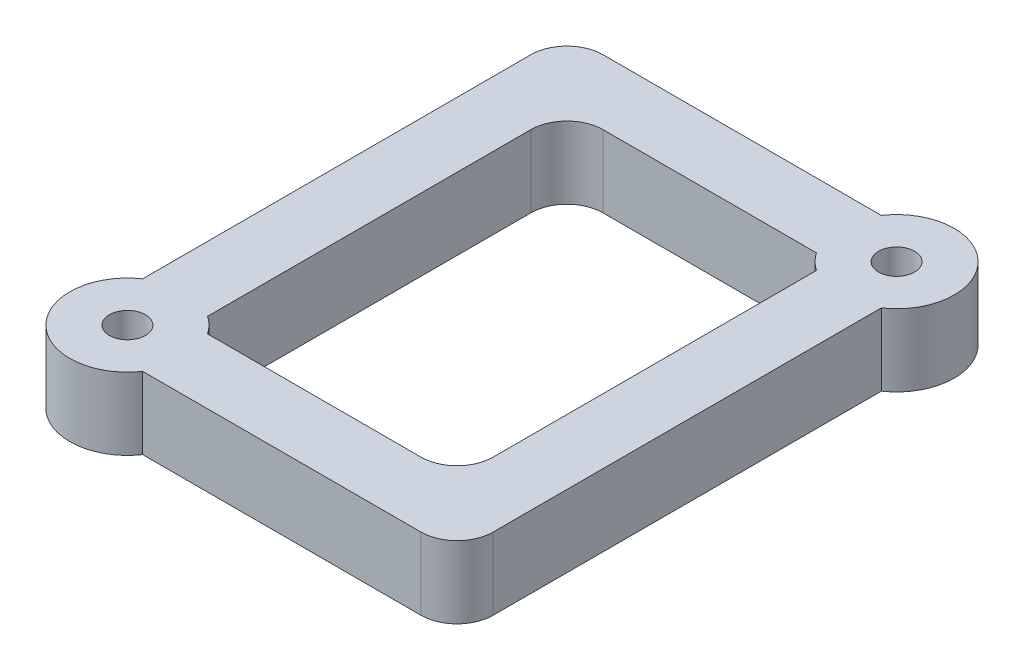
ISO-10303-21;
HEADER;
FILE_DESCRIPTION(('STEP AP214'),'2;1');
FILE_NAME('part.step','',(''),(''),'','','');
FILE_SCHEMA(('AUTOMOTIVE_DESIGN { 1 0 10303 214 1 1 1 1 }'));
ENDSEC;
DATA;
#1=APPLICATION_CONTEXT('core data for automotive mechanical design processes');
#2=APPLICATION_PROTOCOL_DEFINITION('international standard','automotive_design',2000,#1);
#3=PRODUCT_CONTEXT('',#1,'mechanical');
#4=PRODUCT('Part','Part','',(#3));
#5=PRODUCT_RELATED_PRODUCT_CATEGORY('part','',(#4));
#6=PRODUCT_DEFINITION_FORMATION('','',#4);
#7=PRODUCT_DEFINITION_CONTEXT('part definition',#1,'design');
#8=PRODUCT_DEFINITION('design','',#6,#7);
#9=PRODUCT_DEFINITION_SHAPE('','',#8);
#10=(LENGTH_UNIT() NAMED_UNIT(*) SI_UNIT(.MILLI.,.METRE.));
#11=(NAMED_UNIT(*) PLANE_ANGLE_UNIT() SI_UNIT($,.RADIAN.));
#12=(NAMED_UNIT(*) SI_UNIT($,.STERADIAN.) SOLID_ANGLE_UNIT());
#13=UNCERTAINTY_MEASURE_WITH_UNIT(LENGTH_MEASURE(1.E-05),#10,'distance_accuracy_value','');
#14=(GEOMETRIC_REPRESENTATION_CONTEXT(3) GLOBAL_UNCERTAINTY_ASSIGNED_CONTEXT((#13)) GLOBAL_UNIT_ASSIGNED_CONTEXT((#10,
#11,#12)) REPRESENTATION_CONTEXT('',''));
#15=CARTESIAN_POINT('',(0.,0.,0.));
#16=DIRECTION('',(0.,0.,1.));
#17=DIRECTION('',(1.,0.,0.));
#18=AXIS2_PLACEMENT_3D('',#15,#16,#17);
#19=CARTESIAN_POINT('',(0.,2.5,-12.99));
#20=DIRECTION('',(0.,0.,-1.));
#21=DIRECTION('',(-1.,0.,0.));
#22=AXIS2_PLACEMENT_3D('',#19,#20,#21);
#23=PLANE('',#22);
#24=DIRECTION('',(1.,0.,0.));
#25=VECTOR('',#24,1.);
#26=CARTESIAN_POINT('',(0.,2.5,-12.99));
#27=LINE('',#26,#25);
#28=CARTESIAN_POINT('',(-6.68,2.5,-12.99));
#29=VERTEX_POINT('',#28);
#30=CARTESIAN_POINT('',(8.12281086116926,2.5,-12.99));
#31=VERTEX_POINT('',#30);
#32=EDGE_CURVE('E202',#29,#31,#27,.T.);
#33=ORIENTED_EDGE('',*,*,#32,.F.);
#34=DIRECTION('',(0.,-1.,0.));
#35=VECTOR('',#34,1.);
#36=CARTESIAN_POINT('',(-6.68,-2.5,-12.99));
#37=LINE('',#36,#35);
#38=CARTESIAN_POINT('',(-6.68,-2.5,-12.99));
#39=VERTEX_POINT('',#38);
#40=EDGE_CURVE('E279',#29,#39,#37,.T.);
#41=ORIENTED_EDGE('',*,*,#40,.T.);
#42=DIRECTION('',(1.,0.,0.));
#43=VECTOR('',#42,1.);
#44=CARTESIAN_POINT('',(0.,-2.5,-12.99));
#45=LINE('',#44,#43);
#46=CARTESIAN_POINT('',(8.12281086116926,-2.5,-12.99));
#47=VERTEX_POINT('',#46);
#48=EDGE_CURVE('E232',#39,#47,#45,.T.);
#49=ORIENTED_EDGE('',*,*,#48,.T.);
#50=DIRECTION('',(0.,-1.,0.));
#51=VECTOR('',#50,1.);
#52=CARTESIAN_POINT('',(8.12281086116926,2.5,-12.99));
#53=LINE('',#52,#51);
#54=EDGE_CURVE('E250',#31,#47,#53,.T.);
#55=ORIENTED_EDGE('',*,*,#54,.F.);
#56=EDGE_LOOP('',(#33,#41,#49,#55));
#57=FACE_BOUND('',#56,.T.);
#58=ADVANCED_FACE('F41',(#57),#23,.F.);
#59=CARTESIAN_POINT('',(11.43,2.5,-15.24));
#60=DIRECTION('',(0.,-1.,0.));
#61=DIRECTION('',(0.,0.,-1.));
#62=AXIS2_PLACEMENT_3D('',#59,#60,#61);
#63=CYLINDRICAL_SURFACE('',#62,4.);
#64=CARTESIAN_POINT('',(11.43,-2.5,-15.24));
#65=DIRECTION('',(0.,1.,0.));
#66=DIRECTION('',(0.,0.,1.));
#67=AXIS2_PLACEMENT_3D('',#64,#65,#66);
#68=CIRCLE('',#67,4.);
#69=CARTESIAN_POINT('',(9.18,-2.5,-11.9328108611693));
#70=VERTEX_POINT('',#69);
#71=EDGE_CURVE('E221',#47,#70,#68,.T.);
#72=ORIENTED_EDGE('',*,*,#71,.T.);
#73=DIRECTION('',(0.,-1.,0.));
#74=VECTOR('',#73,1.);
#75=CARTESIAN_POINT('',(9.18,2.5,-11.9328108611693));
#76=LINE('',#75,#74);
#77=CARTESIAN_POINT('',(9.18,2.5,-11.9328108611693));
#78=VERTEX_POINT('',#77);
#79=EDGE_CURVE('E247',#78,#70,#76,.T.);
#80=ORIENTED_EDGE('',*,*,#79,.F.);
#81=CARTESIAN_POINT('',(11.43,2.5,-15.24));
#82=DIRECTION('',(0.,1.,0.));
#83=DIRECTION('',(0.,0.,1.));
#84=AXIS2_PLACEMENT_3D('',#81,#82,#83);
#85=CIRCLE('',#84,4.);
#86=EDGE_CURVE('E181',#31,#78,#85,.T.);
#87=ORIENTED_EDGE('',*,*,#86,.F.);
#88=ORIENTED_EDGE('',*,*,#54,.T.);
#89=EDGE_LOOP('',(#72,#80,#87,#88));
#90=FACE_BOUND('',#89,.T.);
#91=ADVANCED_FACE('F305',(#90),#63,.T.);
#92=CARTESIAN_POINT('',(9.18,2.5,0.));
#93=DIRECTION('',(-1.,0.,0.));
#94=DIRECTION('',(0.,0.,1.));
#95=AXIS2_PLACEMENT_3D('',#92,#93,#94);
#96=PLANE('',#95);
#97=DIRECTION('',(0.,0.,-1.));
#98=VECTOR('',#97,1.);
#99=CARTESIAN_POINT('',(9.18,-2.5,0.));
#100=LINE('',#99,#98);
#101=CARTESIAN_POINT('',(9.18,-2.5,10.49));
#102=VERTEX_POINT('',#101);
#103=EDGE_CURVE('E234',#102,#70,#100,.T.);
#104=ORIENTED_EDGE('',*,*,#103,.F.);
#105=DIRECTION('',(0.,-1.,0.));
#106=VECTOR('',#105,1.);
#107=CARTESIAN_POINT('',(9.18,2.5,10.49));
#108=LINE('',#107,#106);
#109=CARTESIAN_POINT('',(9.18,2.5,10.49));
#110=VERTEX_POINT('',#109);
#111=EDGE_CURVE('E277',#102,#110,#108,.F.);
#112=ORIENTED_EDGE('',*,*,#111,.T.);
#113=DIRECTION('',(0.,0.,-1.));
#114=VECTOR('',#113,1.);
#115=CARTESIAN_POINT('',(9.18,2.5,0.));
#116=LINE('',#115,#114);
#117=EDGE_CURVE('E204',#110,#78,#116,.T.);
#118=ORIENTED_EDGE('',*,*,#117,.T.);
#119=ORIENTED_EDGE('',*,*,#79,.T.);
#120=EDGE_LOOP('',(#104,#112,#118,#119));
#121=FACE_BOUND('',#120,.T.);
#122=ADVANCED_FACE('F329',(#121),#96,.T.);
#123=CARTESIAN_POINT('',(0.,2.5,12.99));
#124=DIRECTION('',(0.,0.,-1.));
#125=DIRECTION('',(-1.,0.,0.));
#126=AXIS2_PLACEMENT_3D('',#123,#124,#125);
#127=PLANE('',#126);
#128=DIRECTION('',(1.,0.,0.));
#129=VECTOR('',#128,1.);
#130=CARTESIAN_POINT('',(0.,2.5,12.99));
#131=LINE('',#130,#129);
#132=CARTESIAN_POINT('',(-8.12281086116925,2.5,12.99));
#133=VERTEX_POINT('',#132);
#134=CARTESIAN_POINT('',(6.68,2.5,12.99));
#135=VERTEX_POINT('',#134);
#136=EDGE_CURVE('E206',#133,#135,#131,.T.);
#137=ORIENTED_EDGE('',*,*,#136,.T.);
#138=DIRECTION('',(0.,-1.,0.));
#139=VECTOR('',#138,1.);
#140=CARTESIAN_POINT('',(6.68,-2.5,12.99));
#141=LINE('',#140,#139);
#142=CARTESIAN_POINT('',(6.68,-2.5,12.99));
#143=VERTEX_POINT('',#142);
#144=EDGE_CURVE('E274',#135,#143,#141,.T.);
#145=ORIENTED_EDGE('',*,*,#144,.T.);
#146=DIRECTION('',(1.,0.,0.));
#147=VECTOR('',#146,1.);
#148=CARTESIAN_POINT('',(0.,-2.5,12.99));
#149=LINE('',#148,#147);
#150=CARTESIAN_POINT('',(-8.12281086116925,-2.5,12.99));
#151=VERTEX_POINT('',#150);
#152=EDGE_CURVE('E236',#151,#143,#149,.T.);
#153=ORIENTED_EDGE('',*,*,#152,.F.);
#154=DIRECTION('',(0.,-1.,0.));
#155=VECTOR('',#154,1.);
#156=CARTESIAN_POINT('',(-8.12281086116925,2.5,12.99));
#157=LINE('',#156,#155);
#158=EDGE_CURVE('E245',#133,#151,#157,.T.);
#159=ORIENTED_EDGE('',*,*,#158,.F.);
#160=EDGE_LOOP('',(#137,#145,#153,#159));
#161=FACE_BOUND('',#160,.T.);
#162=ADVANCED_FACE('F314',(#161),#127,.T.);
#163=CARTESIAN_POINT('',(-11.43,2.5,15.24));
#164=DIRECTION('',(0.,-1.,0.));
#165=DIRECTION('',(0.,0.,-1.));
#166=AXIS2_PLACEMENT_3D('',#163,#164,#165);
#167=CYLINDRICAL_SURFACE('',#166,4.);
#168=CARTESIAN_POINT('',(-11.43,-2.5,15.24));
#169=DIRECTION('',(0.,1.,0.));
#170=DIRECTION('',(0.,0.,1.));
#171=AXIS2_PLACEMENT_3D('',#168,#169,#170);
#172=CIRCLE('',#171,4.);
#173=CARTESIAN_POINT('',(-9.18,-2.5,11.9328108611693));
#174=VERTEX_POINT('',#173);
#175=EDGE_CURVE('E230',#151,#174,#172,.T.);
#176=ORIENTED_EDGE('',*,*,#175,.T.);
#177=DIRECTION('',(0.,-1.,0.));
#178=VECTOR('',#177,1.);
#179=CARTESIAN_POINT('',(-9.18,2.5,11.9328108611693));
#180=LINE('',#179,#178);
#181=CARTESIAN_POINT('',(-9.18,2.5,11.9328108611693));
#182=VERTEX_POINT('',#181);
#183=EDGE_CURVE('E169',#182,#174,#180,.T.);
#184=ORIENTED_EDGE('',*,*,#183,.F.);
#185=CARTESIAN_POINT('',(-11.43,2.5,15.24));
#186=DIRECTION('',(0.,1.,0.));
#187=DIRECTION('',(0.,0.,1.));
#188=AXIS2_PLACEMENT_3D('',#185,#186,#187);
#189=CIRCLE('',#188,4.);
#190=EDGE_CURVE('E200',#133,#182,#189,.T.);
#191=ORIENTED_EDGE('',*,*,#190,.F.);
#192=ORIENTED_EDGE('',*,*,#158,.T.);
#193=EDGE_LOOP('',(#176,#184,#191,#192));
#194=FACE_BOUND('',#193,.T.);
#195=ADVANCED_FACE('F317',(#194),#167,.T.);
#196=CARTESIAN_POINT('',(13.68,2.5,0.));
#197=DIRECTION('',(1.,0.,0.));
#198=DIRECTION('',(0.,0.,-1.));
#199=AXIS2_PLACEMENT_3D('',#196,#197,#198);
#200=PLANE('',#199);
#201=DIRECTION('',(0.,0.,1.));
#202=VECTOR('',#201,1.);
#203=CARTESIAN_POINT('',(13.68,2.5,0.));
#204=LINE('',#203,#202);
#205=CARTESIAN_POINT('',(13.68,2.5,-11.9328108611693));
#206=VERTEX_POINT('',#205);
#207=CARTESIAN_POINT('',(13.68,2.5,14.99));
#208=VERTEX_POINT('',#207);
#209=EDGE_CURVE('E162',#206,#208,#204,.T.);
#210=ORIENTED_EDGE('',*,*,#209,.T.);
#211=DIRECTION('',(0.,-1.,0.));
#212=VECTOR('',#211,1.);
#213=CARTESIAN_POINT('',(13.68,2.5,14.99));
#214=LINE('',#213,#212);
#215=CARTESIAN_POINT('',(13.68,-2.5,14.99));
#216=VERTEX_POINT('',#215);
#217=EDGE_CURVE('E253',#208,#216,#214,.T.);
#218=ORIENTED_EDGE('',*,*,#217,.T.);
#219=DIRECTION('',(0.,0.,1.));
#220=VECTOR('',#219,1.);
#221=CARTESIAN_POINT('',(13.68,-2.5,0.));
#222=LINE('',#221,#220);
#223=CARTESIAN_POINT('',(13.68,-2.5,-11.9328108611693));
#224=VERTEX_POINT('',#223);
#225=EDGE_CURVE('E165',#224,#216,#222,.T.);
#226=ORIENTED_EDGE('',*,*,#225,.F.);
#227=DIRECTION('',(0.,-1.,0.));
#228=VECTOR('',#227,1.);
#229=CARTESIAN_POINT('',(13.68,2.5,-11.9328108611693));
#230=LINE('',#229,#228);
#231=EDGE_CURVE('E157',#206,#224,#230,.T.);
#232=ORIENTED_EDGE('',*,*,#231,.F.);
#233=EDGE_LOOP('',(#210,#218,#226,#232));
#234=FACE_BOUND('',#233,.T.);
#235=ADVANCED_FACE('F159',(#234),#200,.T.);
#236=CARTESIAN_POINT('',(8.12281086116926,-2.5,-17.49));
#237=VERTEX_POINT('',#236);
#238=EDGE_CURVE('E218',#224,#237,#68,.T.);
#239=ORIENTED_EDGE('',*,*,#238,.T.);
#240=DIRECTION('',(0.,-1.,0.));
#241=VECTOR('',#240,1.);
#242=CARTESIAN_POINT('',(8.12281086116926,2.5,-17.49));
#243=LINE('',#242,#241);
#244=CARTESIAN_POINT('',(8.12281086116926,2.5,-17.49));
#245=VERTEX_POINT('',#244);
#246=EDGE_CURVE('E170',#245,#237,#243,.T.);
#247=ORIENTED_EDGE('',*,*,#246,.F.);
#248=EDGE_CURVE('E174',#206,#245,#85,.T.);
#249=ORIENTED_EDGE('',*,*,#248,.F.);
#250=ORIENTED_EDGE('',*,*,#231,.T.);
#251=EDGE_LOOP('',(#239,#247,#249,#250));
#252=FACE_BOUND('',#251,.T.);
#253=ADVANCED_FACE('F175',(#252),#63,.T.);
#254=CARTESIAN_POINT('',(0.,2.5,-17.49));
#255=DIRECTION('',(0.,0.,-1.));
#256=DIRECTION('',(-1.,0.,0.));
#257=AXIS2_PLACEMENT_3D('',#254,#255,#256);
#258=PLANE('',#257);
#259=DIRECTION('',(1.,0.,0.));
#260=VECTOR('',#259,1.);
#261=CARTESIAN_POINT('',(0.,-2.5,-17.49));
#262=LINE('',#261,#260);
#263=CARTESIAN_POINT('',(-11.18,-2.5,-17.49));
#264=VERTEX_POINT('',#263);
#265=EDGE_CURVE('E220',#264,#237,#262,.T.);
#266=ORIENTED_EDGE('',*,*,#265,.F.);
#267=DIRECTION('',(0.,-1.,0.));
#268=VECTOR('',#267,1.);
#269=CARTESIAN_POINT('',(-11.18,2.5,-17.49));
#270=LINE('',#269,#268);
#271=CARTESIAN_POINT('',(-11.18,2.5,-17.49));
#272=VERTEX_POINT('',#271);
#273=EDGE_CURVE('E272',#264,#272,#270,.F.);
#274=ORIENTED_EDGE('',*,*,#273,.T.);
#275=DIRECTION('',(1.,0.,0.));
#276=VECTOR('',#275,1.);
#277=CARTESIAN_POINT('',(0.,2.5,-17.49));
#278=LINE('',#277,#276);
#279=EDGE_CURVE('E179',#272,#245,#278,.T.);
#280=ORIENTED_EDGE('',*,*,#279,.T.);
#281=ORIENTED_EDGE('',*,*,#246,.T.);
#282=EDGE_LOOP('',(#266,#274,#280,#281));
#283=FACE_BOUND('',#282,.T.);
#284=ADVANCED_FACE('F352',(#283),#258,.T.);
#285=CARTESIAN_POINT('',(-13.68,2.5,0.));
#286=DIRECTION('',(-1.,0.,0.));
#287=DIRECTION('',(0.,0.,1.));
#288=AXIS2_PLACEMENT_3D('',#285,#286,#287);
#289=PLANE('',#288);
#290=DIRECTION('',(0.,0.,-1.));
#291=VECTOR('',#290,1.);
#292=CARTESIAN_POINT('',(-13.68,2.5,0.));
#293=LINE('',#292,#291);
#294=CARTESIAN_POINT('',(-13.68,2.5,11.9328108611693));
#295=VERTEX_POINT('',#294);
#296=CARTESIAN_POINT('',(-13.68,2.5,-14.99));
#297=VERTEX_POINT('',#296);
#298=EDGE_CURVE('E193',#295,#297,#293,.T.);
#299=ORIENTED_EDGE('',*,*,#298,.T.);
#300=DIRECTION('',(0.,-1.,0.));
#301=VECTOR('',#300,1.);
#302=CARTESIAN_POINT('',(-13.68,2.5,-14.99));
#303=LINE('',#302,#301);
#304=CARTESIAN_POINT('',(-13.68,-2.5,-14.99));
#305=VERTEX_POINT('',#304);
#306=EDGE_CURVE('E269',#297,#305,#303,.T.);
#307=ORIENTED_EDGE('',*,*,#306,.T.);
#308=DIRECTION('',(0.,0.,-1.));
#309=VECTOR('',#308,1.);
#310=CARTESIAN_POINT('',(-13.68,-2.5,0.));
#311=LINE('',#310,#309);
#312=CARTESIAN_POINT('',(-13.68,-2.5,11.9328108611693));
#313=VERTEX_POINT('',#312);
#314=EDGE_CURVE('E223',#313,#305,#311,.T.);
#315=ORIENTED_EDGE('',*,*,#314,.F.);
#316=DIRECTION('',(0.,-1.,0.));
#317=VECTOR('',#316,1.);
#318=CARTESIAN_POINT('',(-13.68,2.5,11.9328108611693));
#319=LINE('',#318,#317);
#320=EDGE_CURVE('E256',#295,#313,#319,.T.);
#321=ORIENTED_EDGE('',*,*,#320,.F.);
#322=EDGE_LOOP('',(#299,#307,#315,#321));
#323=FACE_BOUND('',#322,.T.);
#324=ADVANCED_FACE('F334',(#323),#289,.T.);
#325=CARTESIAN_POINT('',(-8.12281086116925,-2.5,17.49));
#326=VERTEX_POINT('',#325);
#327=EDGE_CURVE('E226',#313,#326,#172,.T.);
#328=ORIENTED_EDGE('',*,*,#327,.T.);
#329=DIRECTION('',(0.,-1.,0.));
#330=VECTOR('',#329,1.);
#331=CARTESIAN_POINT('',(-8.12281086116925,2.5,17.49));
#332=LINE('',#331,#330);
#333=CARTESIAN_POINT('',(-8.12281086116925,2.5,17.49));
#334=VERTEX_POINT('',#333);
#335=EDGE_CURVE('E216',#334,#326,#332,.T.);
#336=ORIENTED_EDGE('',*,*,#335,.F.);
#337=EDGE_CURVE('E196',#295,#334,#189,.T.);
#338=ORIENTED_EDGE('',*,*,#337,.F.);
#339=ORIENTED_EDGE('',*,*,#320,.T.);
#340=EDGE_LOOP('',(#328,#336,#338,#339));
#341=FACE_BOUND('',#340,.T.);
#342=ADVANCED_FACE('F321',(#341),#167,.T.);
#343=CARTESIAN_POINT('',(-11.43,2.5,15.24));
#344=DIRECTION('',(0.,-1.,0.));
#345=DIRECTION('',(0.,0.,-1.));
#346=AXIS2_PLACEMENT_3D('',#343,#344,#345);
#347=CYLINDRICAL_SURFACE('',#346,1.25);
#348=CARTESIAN_POINT('',(-11.43,2.5,15.24));
#349=DIRECTION('',(0.,1.,0.));
#350=DIRECTION('',(0.,0.,1.));
#351=AXIS2_PLACEMENT_3D('',#348,#349,#350);
#352=CIRCLE('',#351,1.25);
#353=CARTESIAN_POINT('',(-11.43,2.5,16.49));
#354=VERTEX_POINT('',#353);
#355=EDGE_CURVE('E210',#354,#354,#352,.T.);
#356=ORIENTED_EDGE('',*,*,#355,.T.);
#357=EDGE_LOOP('',(#356));
#358=FACE_BOUND('',#357,.T.);
#359=CARTESIAN_POINT('',(-11.43,-2.5,15.24));
#360=DIRECTION('',(0.,1.,0.));
#361=DIRECTION('',(0.,0.,1.));
#362=AXIS2_PLACEMENT_3D('',#359,#360,#361);
#363=CIRCLE('',#362,1.25);
#364=CARTESIAN_POINT('',(-11.43,-2.5,16.49));
#365=VERTEX_POINT('',#364);
#366=EDGE_CURVE('E189',#365,#365,#363,.T.);
#367=ORIENTED_EDGE('',*,*,#366,.F.);
#368=EDGE_LOOP('',(#367));
#369=FACE_BOUND('',#368,.T.);
#370=ADVANCED_FACE('F333',(#358,#369),#347,.F.);
#371=CARTESIAN_POINT('',(-9.18,2.5,0.));
#372=DIRECTION('',(-1.,0.,0.));
#373=DIRECTION('',(0.,0.,1.));
#374=AXIS2_PLACEMENT_3D('',#371,#372,#373);
#375=PLANE('',#374);
#376=DIRECTION('',(0.,0.,-1.));
#377=VECTOR('',#376,1.);
#378=CARTESIAN_POINT('',(-9.18,-2.5,0.));
#379=LINE('',#378,#377);
#380=CARTESIAN_POINT('',(-9.18,-2.5,-10.49));
#381=VERTEX_POINT('',#380);
#382=EDGE_CURVE('E239',#174,#381,#379,.T.);
#383=ORIENTED_EDGE('',*,*,#382,.T.);
#384=DIRECTION('',(0.,-1.,0.));
#385=VECTOR('',#384,1.);
#386=CARTESIAN_POINT('',(-9.18,2.5,-10.49));
#387=LINE('',#386,#385);
#388=CARTESIAN_POINT('',(-9.18,2.5,-10.49));
#389=VERTEX_POINT('',#388);
#390=EDGE_CURVE('E56',#381,#389,#387,.F.);
#391=ORIENTED_EDGE('',*,*,#390,.T.);
#392=DIRECTION('',(0.,0.,-1.));
#393=VECTOR('',#392,1.);
#394=CARTESIAN_POINT('',(-9.18,2.5,0.));
#395=LINE('',#394,#393);
#396=EDGE_CURVE('E208',#182,#389,#395,.T.);
#397=ORIENTED_EDGE('',*,*,#396,.F.);
#398=ORIENTED_EDGE('',*,*,#183,.T.);
#399=EDGE_LOOP('',(#383,#391,#397,#398));
#400=FACE_BOUND('',#399,.T.);
#401=ADVANCED_FACE('F294',(#400),#375,.F.);
#402=CARTESIAN_POINT('',(0.,2.5,17.49));
#403=DIRECTION('',(0.,0.,1.));
#404=DIRECTION('',(1.,0.,0.));
#405=AXIS2_PLACEMENT_3D('',#402,#403,#404);
#406=PLANE('',#405);
#407=DIRECTION('',(-1.,0.,0.));
#408=VECTOR('',#407,1.);
#409=CARTESIAN_POINT('',(0.,-2.5,17.49));
#410=LINE('',#409,#408);
#411=CARTESIAN_POINT('',(11.18,-2.5,17.49));
#412=VERTEX_POINT('',#411);
#413=EDGE_CURVE('E229',#412,#326,#410,.T.);
#414=ORIENTED_EDGE('',*,*,#413,.F.);
#415=DIRECTION('',(0.,-1.,0.));
#416=VECTOR('',#415,1.);
#417=CARTESIAN_POINT('',(11.18,2.5,17.49));
#418=LINE('',#417,#416);
#419=CARTESIAN_POINT('',(11.18,2.5,17.49));
#420=VERTEX_POINT('',#419);
#421=EDGE_CURVE('E264',#412,#420,#418,.F.);
#422=ORIENTED_EDGE('',*,*,#421,.T.);
#423=DIRECTION('',(-1.,0.,0.));
#424=VECTOR('',#423,1.);
#425=CARTESIAN_POINT('',(0.,2.5,17.49));
#426=LINE('',#425,#424);
#427=EDGE_CURVE('E199',#420,#334,#426,.T.);
#428=ORIENTED_EDGE('',*,*,#427,.T.);
#429=ORIENTED_EDGE('',*,*,#335,.T.);
#430=EDGE_LOOP('',(#414,#422,#428,#429));
#431=FACE_BOUND('',#430,.T.);
#432=ADVANCED_FACE('F345',(#431),#406,.T.);
#433=CARTESIAN_POINT('',(11.43,2.5,-15.24));
#434=DIRECTION('',(0.,-1.,0.));
#435=DIRECTION('',(0.,0.,-1.));
#436=AXIS2_PLACEMENT_3D('',#433,#434,#435);
#437=CYLINDRICAL_SURFACE('',#436,1.25);
#438=CARTESIAN_POINT('',(11.43,2.5,-15.24));
#439=DIRECTION('',(0.,1.,0.));
#440=DIRECTION('',(0.,0.,1.));
#441=AXIS2_PLACEMENT_3D('',#438,#439,#440);
#442=CIRCLE('',#441,1.25);
#443=CARTESIAN_POINT('',(11.43,2.5,-13.99));
#444=VERTEX_POINT('',#443);
#445=EDGE_CURVE('E213',#444,#444,#442,.T.);
#446=ORIENTED_EDGE('',*,*,#445,.T.);
#447=EDGE_LOOP('',(#446));
#448=FACE_BOUND('',#447,.T.);
#449=CARTESIAN_POINT('',(11.43,-2.5,-15.24));
#450=DIRECTION('',(0.,1.,0.));
#451=DIRECTION('',(0.,0.,1.));
#452=AXIS2_PLACEMENT_3D('',#449,#450,#451);
#453=CIRCLE('',#452,1.25);
#454=CARTESIAN_POINT('',(11.43,-2.5,-13.99));
#455=VERTEX_POINT('',#454);
#456=EDGE_CURVE('E186',#455,#455,#453,.T.);
#457=ORIENTED_EDGE('',*,*,#456,.F.);
#458=EDGE_LOOP('',(#457));
#459=FACE_BOUND('',#458,.T.);
#460=ADVANCED_FACE('F348',(#448,#459),#437,.F.);
#461=CARTESIAN_POINT('',(0.,2.5,0.));
#462=DIRECTION('',(0.,1.,0.));
#463=DIRECTION('',(0.,0.,1.));
#464=AXIS2_PLACEMENT_3D('',#461,#462,#463);
#465=PLANE('',#464);
#466=ORIENTED_EDGE('',*,*,#427,.F.);
#467=CARTESIAN_POINT('',(11.18,2.5,14.99));
#468=DIRECTION('',(0.,1.,0.));
#469=DIRECTION('',(0.,0.,1.));
#470=AXIS2_PLACEMENT_3D('',#467,#468,#469);
#471=CIRCLE('',#470,2.5);
#472=EDGE_CURVE('E185',#420,#208,#471,.T.);
#473=ORIENTED_EDGE('',*,*,#472,.T.);
#474=ORIENTED_EDGE('',*,*,#209,.F.);
#475=ORIENTED_EDGE('',*,*,#248,.T.);
#476=ORIENTED_EDGE('',*,*,#279,.F.);
#477=CARTESIAN_POINT('',(-11.18,2.5,-14.99));
#478=DIRECTION('',(0.,1.,0.));
#479=DIRECTION('',(0.,0.,1.));
#480=AXIS2_PLACEMENT_3D('',#477,#478,#479);
#481=CIRCLE('',#480,2.5);
#482=EDGE_CURVE('E266',#272,#297,#481,.T.);
#483=ORIENTED_EDGE('',*,*,#482,.T.);
#484=ORIENTED_EDGE('',*,*,#298,.F.);
#485=ORIENTED_EDGE('',*,*,#337,.T.);
#486=EDGE_LOOP('',(#466,#473,#474,#475,#476,#483,#484,#485));
#487=FACE_BOUND('',#486,.T.);
#488=ORIENTED_EDGE('',*,*,#396,.T.);
#489=CARTESIAN_POINT('',(-6.68,2.5,-10.49));
#490=DIRECTION('',(0.,1.,0.));
#491=DIRECTION('',(0.,0.,1.));
#492=AXIS2_PLACEMENT_3D('',#489,#490,#491);
#493=CIRCLE('',#492,2.5);
#494=EDGE_CURVE('E11',#389,#29,#493,.F.);
#495=ORIENTED_EDGE('',*,*,#494,.T.);
#496=ORIENTED_EDGE('',*,*,#32,.T.);
#497=ORIENTED_EDGE('',*,*,#86,.T.);
#498=ORIENTED_EDGE('',*,*,#117,.F.);
#499=CARTESIAN_POINT('',(6.68,2.5,10.49));
#500=DIRECTION('',(0.,1.,0.));
#501=DIRECTION('',(0.,0.,1.));
#502=AXIS2_PLACEMENT_3D('',#499,#500,#501);
#503=CIRCLE('',#502,2.5);
#504=EDGE_CURVE('E64',#110,#135,#503,.F.);
#505=ORIENTED_EDGE('',*,*,#504,.T.);
#506=ORIENTED_EDGE('',*,*,#136,.F.);
#507=ORIENTED_EDGE('',*,*,#190,.T.);
#508=EDGE_LOOP('',(#488,#495,#496,#497,#498,#505,#506,#507));
#509=FACE_BOUND('',#508,.T.);
#510=ORIENTED_EDGE('',*,*,#355,.F.);
#511=EDGE_LOOP('',(#510));
#512=FACE_BOUND('',#511,.T.);
#513=ORIENTED_EDGE('',*,*,#445,.F.);
#514=EDGE_LOOP('',(#513));
#515=FACE_BOUND('',#514,.T.);
#516=ADVANCED_FACE('F183',(#487,#509,#512,#515),#465,.T.);
#517=CARTESIAN_POINT('',(0.,-2.5,0.));
#518=DIRECTION('',(0.,1.,0.));
#519=DIRECTION('',(0.,0.,1.));
#520=AXIS2_PLACEMENT_3D('',#517,#518,#519);
#521=PLANE('',#520);
#522=ORIENTED_EDGE('',*,*,#225,.T.);
#523=CARTESIAN_POINT('',(11.18,-2.5,14.99));
#524=DIRECTION('',(0.,1.,0.));
#525=DIRECTION('',(0.,0.,1.));
#526=AXIS2_PLACEMENT_3D('',#523,#524,#525);
#527=CIRCLE('',#526,2.5);
#528=EDGE_CURVE('E262',#216,#412,#527,.F.);
#529=ORIENTED_EDGE('',*,*,#528,.T.);
#530=ORIENTED_EDGE('',*,*,#413,.T.);
#531=ORIENTED_EDGE('',*,*,#327,.F.);
#532=ORIENTED_EDGE('',*,*,#314,.T.);
#533=CARTESIAN_POINT('',(-11.18,-2.5,-14.99));
#534=DIRECTION('',(0.,1.,0.));
#535=DIRECTION('',(0.,0.,1.));
#536=AXIS2_PLACEMENT_3D('',#533,#534,#535);
#537=CIRCLE('',#536,2.5);
#538=EDGE_CURVE('E260',#305,#264,#537,.F.);
#539=ORIENTED_EDGE('',*,*,#538,.T.);
#540=ORIENTED_EDGE('',*,*,#265,.T.);
#541=ORIENTED_EDGE('',*,*,#238,.F.);
#542=EDGE_LOOP('',(#522,#529,#530,#531,#532,#539,#540,#541));
#543=FACE_BOUND('',#542,.T.);
#544=ORIENTED_EDGE('',*,*,#48,.F.);
#545=CARTESIAN_POINT('',(-6.68,-2.5,-10.49));
#546=DIRECTION('',(0.,1.,0.));
#547=DIRECTION('',(0.,0.,1.));
#548=AXIS2_PLACEMENT_3D('',#545,#546,#547);
#549=CIRCLE('',#548,2.5);
#550=EDGE_CURVE('E49',#39,#381,#549,.T.);
#551=ORIENTED_EDGE('',*,*,#550,.T.);
#552=ORIENTED_EDGE('',*,*,#382,.F.);
#553=ORIENTED_EDGE('',*,*,#175,.F.);
#554=ORIENTED_EDGE('',*,*,#152,.T.);
#555=CARTESIAN_POINT('',(6.68,-2.5,10.49));
#556=DIRECTION('',(0.,1.,0.));
#557=DIRECTION('',(0.,0.,1.));
#558=AXIS2_PLACEMENT_3D('',#555,#556,#557);
#559=CIRCLE('',#558,2.5);
#560=EDGE_CURVE('E283',#143,#102,#559,.T.);
#561=ORIENTED_EDGE('',*,*,#560,.T.);
#562=ORIENTED_EDGE('',*,*,#103,.T.);
#563=ORIENTED_EDGE('',*,*,#71,.F.);
#564=EDGE_LOOP('',(#544,#551,#552,#553,#554,#561,#562,#563));
#565=FACE_BOUND('',#564,.T.);
#566=ORIENTED_EDGE('',*,*,#366,.T.);
#567=EDGE_LOOP('',(#566));
#568=FACE_BOUND('',#567,.T.);
#569=ORIENTED_EDGE('',*,*,#456,.T.);
#570=EDGE_LOOP('',(#569));
#571=FACE_BOUND('',#570,.T.);
#572=ADVANCED_FACE('F288',(#543,#565,#568,#571),#521,.F.);
#573=CARTESIAN_POINT('',(11.18,2.5,14.99));
#574=DIRECTION('',(0.,-1.,0.));
#575=DIRECTION('',(0.,0.,-1.));
#576=AXIS2_PLACEMENT_3D('',#573,#574,#575);
#577=CYLINDRICAL_SURFACE('',#576,2.5);
#578=ORIENTED_EDGE('',*,*,#472,.F.);
#579=ORIENTED_EDGE('',*,*,#421,.F.);
#580=ORIENTED_EDGE('',*,*,#528,.F.);
#581=ORIENTED_EDGE('',*,*,#217,.F.);
#582=EDGE_LOOP('',(#578,#579,#580,#581));
#583=FACE_BOUND('',#582,.T.);
#584=ADVANCED_FACE('F357',(#583),#577,.T.);
#585=CARTESIAN_POINT('',(-11.18,2.5,-14.99));
#586=DIRECTION('',(0.,-1.,0.));
#587=DIRECTION('',(0.,0.,-1.));
#588=AXIS2_PLACEMENT_3D('',#585,#586,#587);
#589=CYLINDRICAL_SURFACE('',#588,2.5);
#590=ORIENTED_EDGE('',*,*,#482,.F.);
#591=ORIENTED_EDGE('',*,*,#273,.F.);
#592=ORIENTED_EDGE('',*,*,#538,.F.);
#593=ORIENTED_EDGE('',*,*,#306,.F.);
#594=EDGE_LOOP('',(#590,#591,#592,#593));
#595=FACE_BOUND('',#594,.T.);
#596=ADVANCED_FACE('F360',(#595),#589,.T.);
#597=CARTESIAN_POINT('',(6.68,2.5,10.49));
#598=DIRECTION('',(0.,1.,0.));
#599=DIRECTION('',(0.,0.,1.));
#600=AXIS2_PLACEMENT_3D('',#597,#598,#599);
#601=CYLINDRICAL_SURFACE('',#600,2.5);
#602=ORIENTED_EDGE('',*,*,#504,.F.);
#603=ORIENTED_EDGE('',*,*,#111,.F.);
#604=ORIENTED_EDGE('',*,*,#560,.F.);
#605=ORIENTED_EDGE('',*,*,#144,.F.);
#606=EDGE_LOOP('',(#602,#603,#604,#605));
#607=FACE_BOUND('',#606,.T.);
#608=ADVANCED_FACE('F311',(#607),#601,.F.);
#609=CARTESIAN_POINT('',(-6.68,2.5,-10.49));
#610=DIRECTION('',(0.,1.,0.));
#611=DIRECTION('',(0.,0.,1.));
#612=AXIS2_PLACEMENT_3D('',#609,#610,#611);
#613=CYLINDRICAL_SURFACE('',#612,2.5);
#614=ORIENTED_EDGE('',*,*,#494,.F.);
#615=ORIENTED_EDGE('',*,*,#390,.F.);
#616=ORIENTED_EDGE('',*,*,#550,.F.);
#617=ORIENTED_EDGE('',*,*,#40,.F.);
#618=EDGE_LOOP('',(#614,#615,#616,#617));
#619=FACE_BOUND('',#618,.T.);
#620=ADVANCED_FACE('F43',(#619),#613,.F.);
#621=CLOSED_SHELL('',(#58,#91,#122,#162,#195,#235,#253,#284,#324,#342,#370,#401,#432,#460,#516,
#572,#584,#596,#608,#620));
#622=MANIFOLD_SOLID_BREP('B2',#621);
#623=ADVANCED_BREP_SHAPE_REPRESENTATION('',(#18,#622),#14);
#624=SHAPE_DEFINITION_REPRESENTATION(#9,#623);
ENDSEC;
END-ISO-10303-21;
